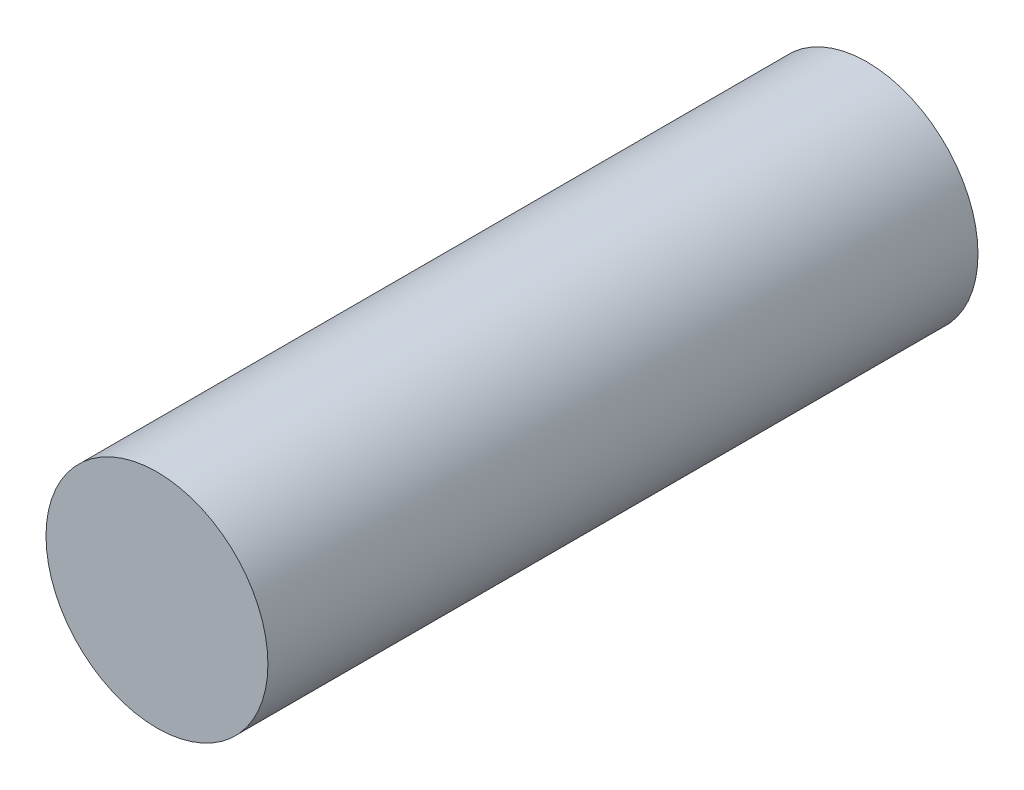
ISO-10303-21;
HEADER;
FILE_DESCRIPTION(('STEP AP214'),'2;1');
FILE_NAME('part.step','',(''),(''),'','','');
FILE_SCHEMA(('AUTOMOTIVE_DESIGN { 1 0 10303 214 1 1 1 1 }'));
ENDSEC;
DATA;
#1=APPLICATION_CONTEXT('core data for automotive mechanical design processes');
#2=APPLICATION_PROTOCOL_DEFINITION('international standard','automotive_design',2000,#1);
#3=PRODUCT_CONTEXT('',#1,'mechanical');
#4=PRODUCT('Part','Part','',(#3));
#5=PRODUCT_RELATED_PRODUCT_CATEGORY('part','',(#4));
#6=PRODUCT_DEFINITION_FORMATION('','',#4);
#7=PRODUCT_DEFINITION_CONTEXT('part definition',#1,'design');
#8=PRODUCT_DEFINITION('design','',#6,#7);
#9=PRODUCT_DEFINITION_SHAPE('','',#8);
#10=(LENGTH_UNIT() NAMED_UNIT(*) SI_UNIT(.MILLI.,.METRE.));
#11=(NAMED_UNIT(*) PLANE_ANGLE_UNIT() SI_UNIT($,.RADIAN.));
#12=(NAMED_UNIT(*) SI_UNIT($,.STERADIAN.) SOLID_ANGLE_UNIT());
#13=UNCERTAINTY_MEASURE_WITH_UNIT(LENGTH_MEASURE(1.E-05),#10,'distance_accuracy_value','');
#14=(GEOMETRIC_REPRESENTATION_CONTEXT(3) GLOBAL_UNCERTAINTY_ASSIGNED_CONTEXT((#13)) GLOBAL_UNIT_ASSIGNED_CONTEXT((#10,
#11,#12)) REPRESENTATION_CONTEXT('',''));
#15=CARTESIAN_POINT('',(0.,0.,0.));
#16=DIRECTION('',(0.,0.,1.));
#17=DIRECTION('',(1.,0.,0.));
#18=AXIS2_PLACEMENT_3D('',#15,#16,#17);
#19=CARTESIAN_POINT('',(0.5,0.,0.));
#20=DIRECTION('',(0.,0.,-1.));
#21=DIRECTION('',(-1.,0.,0.));
#22=AXIS2_PLACEMENT_3D('',#19,#20,#21);
#23=PLANE('',#22);
#24=CARTESIAN_POINT('',(0.,0.,0.));
#25=DIRECTION('',(0.,0.,-1.));
#26=DIRECTION('',(-1.,0.,0.));
#27=AXIS2_PLACEMENT_3D('',#24,#25,#26);
#28=CIRCLE('',#27,0.5);
#29=CARTESIAN_POINT('',(-0.5,0.,0.));
#30=VERTEX_POINT('',#29);
#31=EDGE_CURVE('E18',#30,#30,#28,.F.);
#32=ORIENTED_EDGE('',*,*,#31,.F.);
#33=EDGE_LOOP('',(#32));
#34=FACE_BOUND('',#33,.T.);
#35=ADVANCED_FACE('F15',(#34),#23,.T.);
#36=CARTESIAN_POINT('',(0.5,0.,3.2));
#37=DIRECTION('',(0.,0.,-1.));
#38=DIRECTION('',(-1.,0.,0.));
#39=AXIS2_PLACEMENT_3D('',#36,#37,#38);
#40=PLANE('',#39);
#41=CARTESIAN_POINT('',(0.,0.,3.2));
#42=DIRECTION('',(0.,0.,-1.));
#43=DIRECTION('',(-1.,0.,0.));
#44=AXIS2_PLACEMENT_3D('',#41,#42,#43);
#45=CIRCLE('',#44,0.5);
#46=CARTESIAN_POINT('',(-0.5,0.,3.2));
#47=VERTEX_POINT('',#46);
#48=EDGE_CURVE('E10',#47,#47,#45,.T.);
#49=ORIENTED_EDGE('',*,*,#48,.F.);
#50=EDGE_LOOP('',(#49));
#51=FACE_BOUND('',#50,.T.);
#52=ADVANCED_FACE('F30',(#51),#40,.F.);
#53=CARTESIAN_POINT('',(0.,0.,0.));
#54=DIRECTION('',(0.,0.,-1.));
#55=DIRECTION('',(-1.,0.,0.));
#56=AXIS2_PLACEMENT_3D('',#53,#54,#55);
#57=CYLINDRICAL_SURFACE('',#56,0.5);
#58=ORIENTED_EDGE('',*,*,#31,.T.);
#59=EDGE_LOOP('',(#58));
#60=FACE_BOUND('',#59,.T.);
#61=ORIENTED_EDGE('',*,*,#48,.T.);
#62=EDGE_LOOP('',(#61));
#63=FACE_BOUND('',#62,.T.);
#64=ADVANCED_FACE('F27',(#60,#63),#57,.T.);
#65=CLOSED_SHELL('',(#35,#52,#64));
#66=MANIFOLD_SOLID_BREP('B1',#65);
#67=ADVANCED_BREP_SHAPE_REPRESENTATION('',(#18,#66),#14);
#68=SHAPE_DEFINITION_REPRESENTATION(#9,#67);
ENDSEC;
END-ISO-10303-21;
